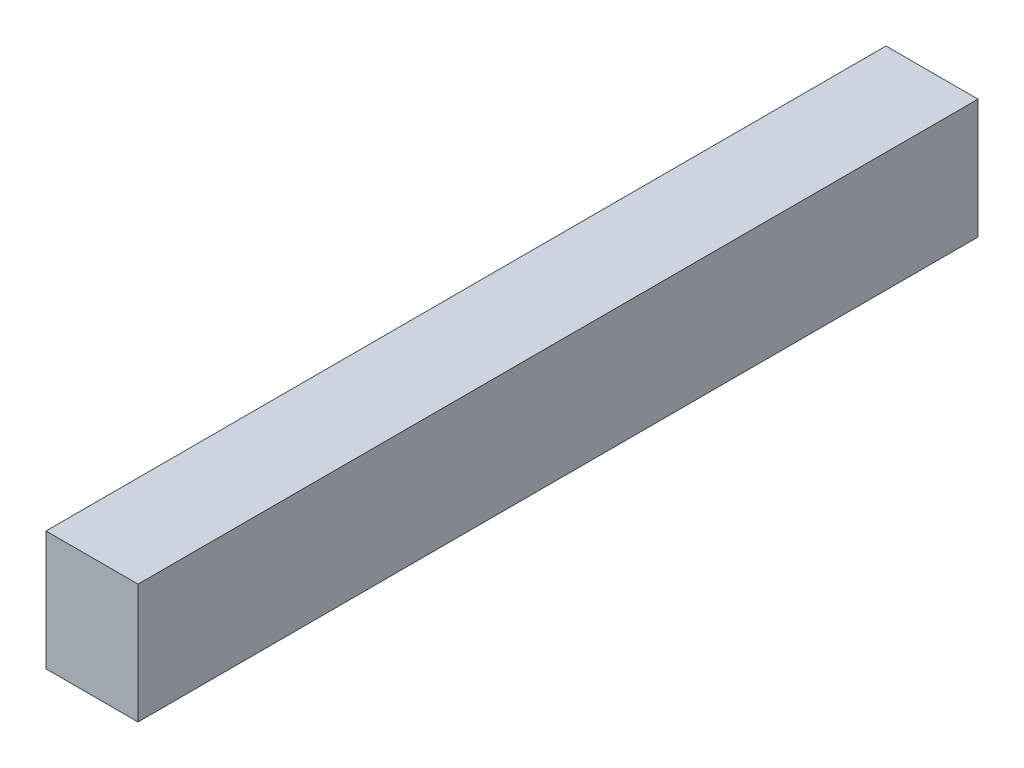
ISO-10303-21;
HEADER;
FILE_DESCRIPTION(('STEP AP214'),'2;1');
FILE_NAME('part.step','',(''),(''),'','','');
FILE_SCHEMA(('AUTOMOTIVE_DESIGN { 1 0 10303 214 1 1 1 1 }'));
ENDSEC;
DATA;
#1=APPLICATION_CONTEXT('core data for automotive mechanical design processes');
#2=APPLICATION_PROTOCOL_DEFINITION('international standard','automotive_design',2000,#1);
#3=PRODUCT_CONTEXT('',#1,'mechanical');
#4=PRODUCT('Part','Part','',(#3));
#5=PRODUCT_RELATED_PRODUCT_CATEGORY('part','',(#4));
#6=PRODUCT_DEFINITION_FORMATION('','',#4);
#7=PRODUCT_DEFINITION_CONTEXT('part definition',#1,'design');
#8=PRODUCT_DEFINITION('design','',#6,#7);
#9=PRODUCT_DEFINITION_SHAPE('','',#8);
#10=(LENGTH_UNIT() NAMED_UNIT(*) SI_UNIT(.MILLI.,.METRE.));
#11=(NAMED_UNIT(*) PLANE_ANGLE_UNIT() SI_UNIT($,.RADIAN.));
#12=(NAMED_UNIT(*) SI_UNIT($,.STERADIAN.) SOLID_ANGLE_UNIT());
#13=UNCERTAINTY_MEASURE_WITH_UNIT(LENGTH_MEASURE(1.E-05),#10,'distance_accuracy_value','');
#14=(GEOMETRIC_REPRESENTATION_CONTEXT(3) GLOBAL_UNCERTAINTY_ASSIGNED_CONTEXT((#13)) GLOBAL_UNIT_ASSIGNED_CONTEXT((#10,
#11,#12)) REPRESENTATION_CONTEXT('',''));
#15=CARTESIAN_POINT('',(0.,0.,0.));
#16=DIRECTION('',(0.,0.,1.));
#17=DIRECTION('',(1.,0.,0.));
#18=AXIS2_PLACEMENT_3D('',#15,#16,#17);
#19=CARTESIAN_POINT('',(100.475571989632,89.1101248035877,67.3229601149979));
#20=DIRECTION('',(0.,0.,1.));
#21=DIRECTION('',(1.,0.,0.));
#22=AXIS2_PLACEMENT_3D('',#19,#20,#21);
#23=PLANE('',#22);
#24=DIRECTION('',(0.,-1.,0.));
#25=VECTOR('',#24,1.);
#26=CARTESIAN_POINT('',(97.8307465105003,89.1101248035876,67.3229601149979));
#27=LINE('',#26,#25);
#28=CARTESIAN_POINT('',(97.8307465105003,89.1101248035876,67.3229601149979));
#29=VERTEX_POINT('',#28);
#30=CARTESIAN_POINT('',(97.8307465105003,88.4612751946148,67.3229601149979));
#31=VERTEX_POINT('',#30);
#32=EDGE_CURVE('E28',#29,#31,#27,.T.);
#33=ORIENTED_EDGE('',*,*,#32,.F.);
#34=DIRECTION('',(-1.,0.,0.));
#35=VECTOR('',#34,1.);
#36=CARTESIAN_POINT('',(100.475571989632,89.1101248035877,67.3229601149979));
#37=LINE('',#36,#35);
#38=CARTESIAN_POINT('',(97.3307465105003,89.1101248035876,67.3229601149979));
#39=VERTEX_POINT('',#38);
#40=EDGE_CURVE('E81',#29,#39,#37,.T.);
#41=ORIENTED_EDGE('',*,*,#40,.T.);
#42=DIRECTION('',(0.,1.,0.));
#43=VECTOR('',#42,1.);
#44=CARTESIAN_POINT('',(97.3307465105003,89.1101248035876,67.3229601149979));
#45=LINE('',#44,#43);
#46=CARTESIAN_POINT('',(97.3307465105003,88.4612751946148,67.3229601149979));
#47=VERTEX_POINT('',#46);
#48=EDGE_CURVE('E11',#47,#39,#45,.T.);
#49=ORIENTED_EDGE('',*,*,#48,.F.);
#50=DIRECTION('',(-1.,0.,0.));
#51=VECTOR('',#50,1.);
#52=CARTESIAN_POINT('',(100.475571989632,88.4612751946148,67.3229601149979));
#53=LINE('',#52,#51);
#54=EDGE_CURVE('E78',#31,#47,#53,.T.);
#55=ORIENTED_EDGE('',*,*,#54,.F.);
#56=EDGE_LOOP('',(#33,#41,#49,#55));
#57=FACE_BOUND('',#56,.T.);
#58=ADVANCED_FACE('F17',(#57),#23,.T.);
#59=CARTESIAN_POINT('',(97.3307465105003,88.7856999991012,66.3229601149979));
#60=DIRECTION('',(-1.,0.,0.));
#61=DIRECTION('',(0.,1.,0.));
#62=AXIS2_PLACEMENT_3D('',#59,#60,#61);
#63=PLANE('',#62);
#64=DIRECTION('',(0.,0.,-1.));
#65=VECTOR('',#64,1.);
#66=CARTESIAN_POINT('',(97.3307465105003,89.1101248035876,62.7589601149979));
#67=LINE('',#66,#65);
#68=CARTESIAN_POINT('',(97.3307465105003,89.1101248035876,62.7589601149979));
#69=VERTEX_POINT('',#68);
#70=EDGE_CURVE('E106',#39,#69,#67,.T.);
#71=ORIENTED_EDGE('',*,*,#70,.T.);
#72=DIRECTION('',(0.,-1.,0.));
#73=VECTOR('',#72,1.);
#74=CARTESIAN_POINT('',(97.3307465105003,88.4612751946147,62.7589601149979));
#75=LINE('',#74,#73);
#76=CARTESIAN_POINT('',(97.3307465105003,88.4612751946147,62.7589601149979));
#77=VERTEX_POINT('',#76);
#78=EDGE_CURVE('E21',#69,#77,#75,.T.);
#79=ORIENTED_EDGE('',*,*,#78,.T.);
#80=DIRECTION('',(0.,0.,1.));
#81=VECTOR('',#80,1.);
#82=CARTESIAN_POINT('',(97.3307465105003,88.4612751946147,62.7589601149979));
#83=LINE('',#82,#81);
#84=EDGE_CURVE('E87',#77,#47,#83,.T.);
#85=ORIENTED_EDGE('',*,*,#84,.T.);
#86=ORIENTED_EDGE('',*,*,#48,.T.);
#87=EDGE_LOOP('',(#71,#79,#85,#86));
#88=FACE_BOUND('',#87,.T.);
#89=ADVANCED_FACE('F19',(#88),#63,.T.);
#90=CARTESIAN_POINT('',(97.8307465105003,88.7856999991012,66.3229601149979));
#91=DIRECTION('',(-1.,0.,0.));
#92=DIRECTION('',(0.,1.,0.));
#93=AXIS2_PLACEMENT_3D('',#90,#91,#92);
#94=PLANE('',#93);
#95=DIRECTION('',(0.,0.,-1.));
#96=VECTOR('',#95,1.);
#97=CARTESIAN_POINT('',(97.8307465105003,89.1101248035876,62.7589601149979));
#98=LINE('',#97,#96);
#99=CARTESIAN_POINT('',(97.8307465105003,89.1101248035876,62.7589601149979));
#100=VERTEX_POINT('',#99);
#101=EDGE_CURVE('E102',#29,#100,#98,.T.);
#102=ORIENTED_EDGE('',*,*,#101,.F.);
#103=ORIENTED_EDGE('',*,*,#32,.T.);
#104=DIRECTION('',(0.,0.,1.));
#105=VECTOR('',#104,1.);
#106=CARTESIAN_POINT('',(97.8307465105003,88.4612751946147,62.7589601149979));
#107=LINE('',#106,#105);
#108=CARTESIAN_POINT('',(97.8307465105003,88.4612751946147,62.7589601149979));
#109=VERTEX_POINT('',#108);
#110=EDGE_CURVE('E88',#109,#31,#107,.T.);
#111=ORIENTED_EDGE('',*,*,#110,.F.);
#112=DIRECTION('',(0.,-1.,0.));
#113=VECTOR('',#112,1.);
#114=CARTESIAN_POINT('',(97.8307465105003,88.4612751946147,62.7589601149979));
#115=LINE('',#114,#113);
#116=EDGE_CURVE('E63',#100,#109,#115,.T.);
#117=ORIENTED_EDGE('',*,*,#116,.F.);
#118=EDGE_LOOP('',(#102,#103,#111,#117));
#119=FACE_BOUND('',#118,.T.);
#120=ADVANCED_FACE('F119',(#119),#94,.F.);
#121=CARTESIAN_POINT('',(97.8307465105003,88.4612751946147,62.7589601149979));
#122=DIRECTION('',(0.,0.,-1.));
#123=DIRECTION('',(-1.,0.,0.));
#124=AXIS2_PLACEMENT_3D('',#121,#122,#123);
#125=PLANE('',#124);
#126=ORIENTED_EDGE('',*,*,#78,.F.);
#127=DIRECTION('',(-1.,0.,0.));
#128=VECTOR('',#127,1.);
#129=CARTESIAN_POINT('',(97.8307465105003,89.1101248035876,62.7589601149979));
#130=LINE('',#129,#128);
#131=EDGE_CURVE('E93',#100,#69,#130,.T.);
#132=ORIENTED_EDGE('',*,*,#131,.F.);
#133=ORIENTED_EDGE('',*,*,#116,.T.);
#134=DIRECTION('',(-1.,0.,0.));
#135=VECTOR('',#134,1.);
#136=CARTESIAN_POINT('',(97.8307465105003,88.4612751946147,62.7589601149979));
#137=LINE('',#136,#135);
#138=EDGE_CURVE('E92',#109,#77,#137,.T.);
#139=ORIENTED_EDGE('',*,*,#138,.T.);
#140=EDGE_LOOP('',(#126,#132,#133,#139));
#141=FACE_BOUND('',#140,.T.);
#142=ADVANCED_FACE('F121',(#141),#125,.T.);
#143=CARTESIAN_POINT('',(97.8307465105003,88.4612751946147,62.7589601149979));
#144=DIRECTION('',(0.,-1.,0.));
#145=DIRECTION('',(-1.,0.,0.));
#146=AXIS2_PLACEMENT_3D('',#143,#144,#145);
#147=PLANE('',#146);
#148=ORIENTED_EDGE('',*,*,#84,.F.);
#149=ORIENTED_EDGE('',*,*,#138,.F.);
#150=ORIENTED_EDGE('',*,*,#110,.T.);
#151=ORIENTED_EDGE('',*,*,#54,.T.);
#152=EDGE_LOOP('',(#148,#149,#150,#151));
#153=FACE_BOUND('',#152,.T.);
#154=ADVANCED_FACE('F85',(#153),#147,.T.);
#155=CARTESIAN_POINT('',(97.8307465105003,89.1101248035876,62.7589601149979));
#156=DIRECTION('',(0.,1.,0.));
#157=DIRECTION('',(0.,0.,-1.));
#158=AXIS2_PLACEMENT_3D('',#155,#156,#157);
#159=PLANE('',#158);
#160=ORIENTED_EDGE('',*,*,#70,.F.);
#161=ORIENTED_EDGE('',*,*,#40,.F.);
#162=ORIENTED_EDGE('',*,*,#101,.T.);
#163=ORIENTED_EDGE('',*,*,#131,.T.);
#164=EDGE_LOOP('',(#160,#161,#162,#163));
#165=FACE_BOUND('',#164,.T.);
#166=ADVANCED_FACE('F118',(#165),#159,.T.);
#167=CLOSED_SHELL('',(#58,#89,#120,#142,#154,#166));
#168=MANIFOLD_SOLID_BREP('B1',#167);
#169=ADVANCED_BREP_SHAPE_REPRESENTATION('',(#18,#168),#14);
#170=SHAPE_DEFINITION_REPRESENTATION(#9,#169);
ENDSEC;
END-ISO-10303-21;
